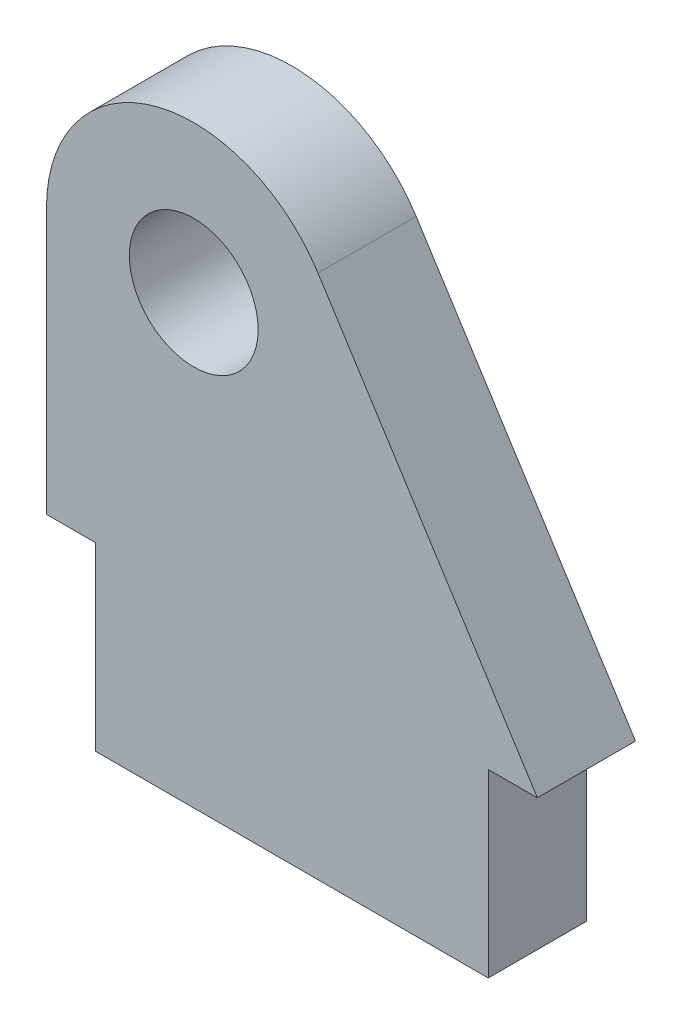
ISO-10303-21;
HEADER;
FILE_DESCRIPTION(('STEP AP214'),'2;1');
FILE_NAME('part.step','',(''),(''),'','','');
FILE_SCHEMA(('AUTOMOTIVE_DESIGN { 1 0 10303 214 1 1 1 1 }'));
ENDSEC;
DATA;
#1=APPLICATION_CONTEXT('core data for automotive mechanical design processes');
#2=APPLICATION_PROTOCOL_DEFINITION('international standard','automotive_design',2000,#1);
#3=PRODUCT_CONTEXT('',#1,'mechanical');
#4=PRODUCT('Part','Part','',(#3));
#5=PRODUCT_RELATED_PRODUCT_CATEGORY('part','',(#4));
#6=PRODUCT_DEFINITION_FORMATION('','',#4);
#7=PRODUCT_DEFINITION_CONTEXT('part definition',#1,'design');
#8=PRODUCT_DEFINITION('design','',#6,#7);
#9=PRODUCT_DEFINITION_SHAPE('','',#8);
#10=(LENGTH_UNIT() NAMED_UNIT(*) SI_UNIT(.MILLI.,.METRE.));
#11=(NAMED_UNIT(*) PLANE_ANGLE_UNIT() SI_UNIT($,.RADIAN.));
#12=(NAMED_UNIT(*) SI_UNIT($,.STERADIAN.) SOLID_ANGLE_UNIT());
#13=UNCERTAINTY_MEASURE_WITH_UNIT(LENGTH_MEASURE(1.E-05),#10,'distance_accuracy_value','');
#14=(GEOMETRIC_REPRESENTATION_CONTEXT(3) GLOBAL_UNCERTAINTY_ASSIGNED_CONTEXT((#13)) GLOBAL_UNIT_ASSIGNED_CONTEXT((#10,
#11,#12)) REPRESENTATION_CONTEXT('',''));
#15=CARTESIAN_POINT('',(0.,0.,0.));
#16=DIRECTION('',(0.,0.,1.));
#17=DIRECTION('',(1.,0.,0.));
#18=AXIS2_PLACEMENT_3D('',#15,#16,#17);
#19=CARTESIAN_POINT('',(-3.175,11.5138708,3.175));
#20=DIRECTION('',(0.,0.,1.));
#21=DIRECTION('',(1.,0.,0.));
#22=AXIS2_PLACEMENT_3D('',#19,#20,#21);
#23=PLANE('',#22);
#24=DIRECTION('',(1.,0.,0.));
#25=VECTOR('',#24,1.);
#26=CARTESIAN_POINT('',(-7.9375,2.921,3.175));
#27=LINE('',#26,#25);
#28=CARTESIAN_POINT('',(-7.9375,2.921,3.175));
#29=VERTEX_POINT('',#28);
#30=CARTESIAN_POINT('',(-6.35,2.921,3.175));
#31=VERTEX_POINT('',#30);
#32=EDGE_CURVE('E147',#29,#31,#27,.T.);
#33=ORIENTED_EDGE('',*,*,#32,.T.);
#34=DIRECTION('',(0.,-1.,0.));
#35=VECTOR('',#34,1.);
#36=CARTESIAN_POINT('',(-6.35,-2.921,3.175));
#37=LINE('',#36,#35);
#38=CARTESIAN_POINT('',(-6.35,-2.921,3.175));
#39=VERTEX_POINT('',#38);
#40=EDGE_CURVE('E95',#31,#39,#37,.T.);
#41=ORIENTED_EDGE('',*,*,#40,.T.);
#42=DIRECTION('',(1.,0.,0.));
#43=VECTOR('',#42,1.);
#44=CARTESIAN_POINT('',(6.35,-2.921,3.175));
#45=LINE('',#44,#43);
#46=CARTESIAN_POINT('',(6.35,-2.921,3.175));
#47=VERTEX_POINT('',#46);
#48=EDGE_CURVE('E162',#39,#47,#45,.T.);
#49=ORIENTED_EDGE('',*,*,#48,.T.);
#50=DIRECTION('',(0.,1.,0.));
#51=VECTOR('',#50,1.);
#52=CARTESIAN_POINT('',(6.35,-2.921,3.175));
#53=LINE('',#52,#51);
#54=CARTESIAN_POINT('',(6.35,2.921,3.175));
#55=VERTEX_POINT('',#54);
#56=EDGE_CURVE('E175',#47,#55,#53,.T.);
#57=ORIENTED_EDGE('',*,*,#56,.T.);
#58=DIRECTION('',(1.,0.,0.));
#59=VECTOR('',#58,1.);
#60=CARTESIAN_POINT('',(6.35,2.921,3.175));
#61=LINE('',#60,#59);
#62=CARTESIAN_POINT('',(7.9375,2.921,3.175));
#63=VERTEX_POINT('',#62);
#64=EDGE_CURVE('E114',#55,#63,#61,.T.);
#65=ORIENTED_EDGE('',*,*,#64,.T.);
#66=DIRECTION('',(-0.536836328902273,0.84368640854925,0.));
#67=VECTOR('',#66,1.);
#68=CARTESIAN_POINT('',(7.9375,2.921,3.175));
#69=LINE('',#68,#67);
#70=CARTESIAN_POINT('',(0.8430565207158,14.0705538163971,3.175));
#71=VERTEX_POINT('',#70);
#72=EDGE_CURVE('E108',#63,#71,#69,.T.);
#73=ORIENTED_EDGE('',*,*,#72,.T.);
#74=CARTESIAN_POINT('',(-3.175,11.5138708,3.175));
#75=DIRECTION('',(0.,0.,1.));
#76=DIRECTION('',(1.,0.,0.));
#77=AXIS2_PLACEMENT_3D('',#74,#75,#76);
#78=CIRCLE('',#77,4.7625);
#79=CARTESIAN_POINT('',(-7.9375,11.5138708,3.175));
#80=VERTEX_POINT('',#79);
#81=EDGE_CURVE('E112',#71,#80,#78,.T.);
#82=ORIENTED_EDGE('',*,*,#81,.T.);
#83=DIRECTION('',(0.,-1.,0.));
#84=VECTOR('',#83,1.);
#85=CARTESIAN_POINT('',(-7.9375,2.921,3.175));
#86=LINE('',#85,#84);
#87=EDGE_CURVE('E52',#80,#29,#86,.T.);
#88=ORIENTED_EDGE('',*,*,#87,.T.);
#89=EDGE_LOOP('',(#33,#41,#49,#57,#65,#73,#82,#88));
#90=FACE_BOUND('',#89,.T.);
#91=CARTESIAN_POINT('',(-3.175,11.5138708,3.175));
#92=DIRECTION('',(0.,0.,1.));
#93=DIRECTION('',(1.,0.,0.));
#94=AXIS2_PLACEMENT_3D('',#91,#92,#93);
#95=CIRCLE('',#94,2.0828);
#96=CARTESIAN_POINT('',(-1.0922,11.5138708,3.175));
#97=VERTEX_POINT('',#96);
#98=EDGE_CURVE('E136',#97,#97,#95,.T.);
#99=ORIENTED_EDGE('',*,*,#98,.F.);
#100=EDGE_LOOP('',(#99));
#101=FACE_BOUND('',#100,.T.);
#102=ADVANCED_FACE('F35',(#90,#101),#23,.T.);
#103=CARTESIAN_POINT('',(-3.175,11.5138708,0.));
#104=DIRECTION('',(0.,0.,1.));
#105=DIRECTION('',(1.,0.,0.));
#106=AXIS2_PLACEMENT_3D('',#103,#104,#105);
#107=PLANE('',#106);
#108=DIRECTION('',(1.,0.,0.));
#109=VECTOR('',#108,1.);
#110=CARTESIAN_POINT('',(-7.9375,2.921,0.));
#111=LINE('',#110,#109);
#112=CARTESIAN_POINT('',(-7.9375,2.921,0.));
#113=VERTEX_POINT('',#112);
#114=CARTESIAN_POINT('',(-6.35,2.921,0.));
#115=VERTEX_POINT('',#114);
#116=EDGE_CURVE('E132',#113,#115,#111,.T.);
#117=ORIENTED_EDGE('',*,*,#116,.F.);
#118=DIRECTION('',(0.,-1.,0.));
#119=VECTOR('',#118,1.);
#120=CARTESIAN_POINT('',(-7.9375,2.921,0.));
#121=LINE('',#120,#119);
#122=CARTESIAN_POINT('',(-7.9375,11.5138708,0.));
#123=VERTEX_POINT('',#122);
#124=EDGE_CURVE('E87',#123,#113,#121,.T.);
#125=ORIENTED_EDGE('',*,*,#124,.F.);
#126=CARTESIAN_POINT('',(-3.175,11.5138708,0.));
#127=DIRECTION('',(0.,0.,1.));
#128=DIRECTION('',(1.,0.,0.));
#129=AXIS2_PLACEMENT_3D('',#126,#127,#128);
#130=CIRCLE('',#129,4.7625);
#131=CARTESIAN_POINT('',(0.8430565207158,14.0705538163971,0.));
#132=VERTEX_POINT('',#131);
#133=EDGE_CURVE('E81',#132,#123,#130,.T.);
#134=ORIENTED_EDGE('',*,*,#133,.F.);
#135=DIRECTION('',(-0.536836328902273,0.84368640854925,0.));
#136=VECTOR('',#135,1.);
#137=CARTESIAN_POINT('',(7.9375,2.921,0.));
#138=LINE('',#137,#136);
#139=CARTESIAN_POINT('',(7.9375,2.921,0.));
#140=VERTEX_POINT('',#139);
#141=EDGE_CURVE('E122',#140,#132,#138,.T.);
#142=ORIENTED_EDGE('',*,*,#141,.F.);
#143=DIRECTION('',(1.,0.,0.));
#144=VECTOR('',#143,1.);
#145=CARTESIAN_POINT('',(6.35,2.921,0.));
#146=LINE('',#145,#144);
#147=CARTESIAN_POINT('',(6.35,2.921,0.));
#148=VERTEX_POINT('',#147);
#149=EDGE_CURVE('E142',#148,#140,#146,.T.);
#150=ORIENTED_EDGE('',*,*,#149,.F.);
#151=DIRECTION('',(0.,1.,0.));
#152=VECTOR('',#151,1.);
#153=CARTESIAN_POINT('',(6.35,-2.921,0.));
#154=LINE('',#153,#152);
#155=CARTESIAN_POINT('',(6.35,-2.921,0.));
#156=VERTEX_POINT('',#155);
#157=EDGE_CURVE('E140',#156,#148,#154,.T.);
#158=ORIENTED_EDGE('',*,*,#157,.F.);
#159=DIRECTION('',(1.,0.,0.));
#160=VECTOR('',#159,1.);
#161=CARTESIAN_POINT('',(6.35,-2.921,0.));
#162=LINE('',#161,#160);
#163=CARTESIAN_POINT('',(-6.35,-2.921,0.));
#164=VERTEX_POINT('',#163);
#165=EDGE_CURVE('E138',#164,#156,#162,.T.);
#166=ORIENTED_EDGE('',*,*,#165,.F.);
#167=DIRECTION('',(0.,-1.,0.));
#168=VECTOR('',#167,1.);
#169=CARTESIAN_POINT('',(-6.35,-2.921,0.));
#170=LINE('',#169,#168);
#171=EDGE_CURVE('E135',#115,#164,#170,.T.);
#172=ORIENTED_EDGE('',*,*,#171,.F.);
#173=EDGE_LOOP('',(#117,#125,#134,#142,#150,#158,#166,#172));
#174=FACE_BOUND('',#173,.T.);
#175=CARTESIAN_POINT('',(-3.175,11.5138708,0.));
#176=DIRECTION('',(0.,0.,1.));
#177=DIRECTION('',(1.,0.,0.));
#178=AXIS2_PLACEMENT_3D('',#175,#176,#177);
#179=CIRCLE('',#178,2.0828);
#180=CARTESIAN_POINT('',(-1.0922,11.5138708,0.));
#181=VERTEX_POINT('',#180);
#182=EDGE_CURVE('E181',#181,#181,#179,.T.);
#183=ORIENTED_EDGE('',*,*,#182,.T.);
#184=EDGE_LOOP('',(#183));
#185=FACE_BOUND('',#184,.T.);
#186=ADVANCED_FACE('F166',(#174,#185),#107,.F.);
#187=CARTESIAN_POINT('',(-7.9375,2.921,3.175));
#188=DIRECTION('',(0.,1.,0.));
#189=DIRECTION('',(0.,0.,1.));
#190=AXIS2_PLACEMENT_3D('',#187,#188,#189);
#191=PLANE('',#190);
#192=ORIENTED_EDGE('',*,*,#116,.T.);
#193=DIRECTION('',(0.,0.,-1.));
#194=VECTOR('',#193,1.);
#195=CARTESIAN_POINT('',(-6.35,2.921,3.175));
#196=LINE('',#195,#194);
#197=EDGE_CURVE('E11',#31,#115,#196,.T.);
#198=ORIENTED_EDGE('',*,*,#197,.F.);
#199=ORIENTED_EDGE('',*,*,#32,.F.);
#200=DIRECTION('',(0.,0.,-1.));
#201=VECTOR('',#200,1.);
#202=CARTESIAN_POINT('',(-7.9375,2.921,3.175));
#203=LINE('',#202,#201);
#204=EDGE_CURVE('E128',#29,#113,#203,.T.);
#205=ORIENTED_EDGE('',*,*,#204,.T.);
#206=EDGE_LOOP('',(#192,#198,#199,#205));
#207=FACE_BOUND('',#206,.T.);
#208=ADVANCED_FACE('F37',(#207),#191,.F.);
#209=CARTESIAN_POINT('',(-6.35,-2.921,3.175));
#210=DIRECTION('',(1.,0.,0.));
#211=DIRECTION('',(0.,0.,-1.));
#212=AXIS2_PLACEMENT_3D('',#209,#210,#211);
#213=PLANE('',#212);
#214=ORIENTED_EDGE('',*,*,#171,.T.);
#215=DIRECTION('',(0.,0.,-1.));
#216=VECTOR('',#215,1.);
#217=CARTESIAN_POINT('',(-6.35,-2.921,3.175));
#218=LINE('',#217,#216);
#219=EDGE_CURVE('E44',#39,#164,#218,.T.);
#220=ORIENTED_EDGE('',*,*,#219,.F.);
#221=ORIENTED_EDGE('',*,*,#40,.F.);
#222=ORIENTED_EDGE('',*,*,#197,.T.);
#223=EDGE_LOOP('',(#214,#220,#221,#222));
#224=FACE_BOUND('',#223,.T.);
#225=ADVANCED_FACE('F209',(#224),#213,.F.);
#226=CARTESIAN_POINT('',(6.35,-2.921,3.175));
#227=DIRECTION('',(0.,1.,0.));
#228=DIRECTION('',(-1.,0.,0.));
#229=AXIS2_PLACEMENT_3D('',#226,#227,#228);
#230=PLANE('',#229);
#231=ORIENTED_EDGE('',*,*,#165,.T.);
#232=DIRECTION('',(0.,0.,-1.));
#233=VECTOR('',#232,1.);
#234=CARTESIAN_POINT('',(6.35,-2.921,3.175));
#235=LINE('',#234,#233);
#236=EDGE_CURVE('E154',#47,#156,#235,.T.);
#237=ORIENTED_EDGE('',*,*,#236,.F.);
#238=ORIENTED_EDGE('',*,*,#48,.F.);
#239=ORIENTED_EDGE('',*,*,#219,.T.);
#240=EDGE_LOOP('',(#231,#237,#238,#239));
#241=FACE_BOUND('',#240,.T.);
#242=ADVANCED_FACE('F160',(#241),#230,.F.);
#243=CARTESIAN_POINT('',(6.35,-2.921,3.175));
#244=DIRECTION('',(-1.,0.,0.));
#245=DIRECTION('',(0.,0.,1.));
#246=AXIS2_PLACEMENT_3D('',#243,#244,#245);
#247=PLANE('',#246);
#248=ORIENTED_EDGE('',*,*,#157,.T.);
#249=DIRECTION('',(0.,0.,-1.));
#250=VECTOR('',#249,1.);
#251=CARTESIAN_POINT('',(6.35,2.921,3.175));
#252=LINE('',#251,#250);
#253=EDGE_CURVE('E151',#55,#148,#252,.T.);
#254=ORIENTED_EDGE('',*,*,#253,.F.);
#255=ORIENTED_EDGE('',*,*,#56,.F.);
#256=ORIENTED_EDGE('',*,*,#236,.T.);
#257=EDGE_LOOP('',(#248,#254,#255,#256));
#258=FACE_BOUND('',#257,.T.);
#259=ADVANCED_FACE('F171',(#258),#247,.F.);
#260=CARTESIAN_POINT('',(6.35,2.921,3.175));
#261=DIRECTION('',(0.,1.,0.));
#262=DIRECTION('',(-1.,0.,0.));
#263=AXIS2_PLACEMENT_3D('',#260,#261,#262);
#264=PLANE('',#263);
#265=ORIENTED_EDGE('',*,*,#149,.T.);
#266=DIRECTION('',(0.,0.,-1.));
#267=VECTOR('',#266,1.);
#268=CARTESIAN_POINT('',(7.9375,2.921,3.175));
#269=LINE('',#268,#267);
#270=EDGE_CURVE('E123',#63,#140,#269,.T.);
#271=ORIENTED_EDGE('',*,*,#270,.F.);
#272=ORIENTED_EDGE('',*,*,#64,.F.);
#273=ORIENTED_EDGE('',*,*,#253,.T.);
#274=EDGE_LOOP('',(#265,#271,#272,#273));
#275=FACE_BOUND('',#274,.T.);
#276=ADVANCED_FACE('F174',(#275),#264,.F.);
#277=CARTESIAN_POINT('',(7.9375,2.921,3.175));
#278=DIRECTION('',(-0.843686408549249,-0.536836328902272,0.));
#279=DIRECTION('',(0.536836328902273,-0.84368640854925,0.));
#280=AXIS2_PLACEMENT_3D('',#277,#278,#279);
#281=PLANE('',#280);
#282=ORIENTED_EDGE('',*,*,#141,.T.);
#283=DIRECTION('',(0.,0.,-1.));
#284=VECTOR('',#283,1.);
#285=CARTESIAN_POINT('',(0.8430565207158,14.0705538163971,3.175));
#286=LINE('',#285,#284);
#287=EDGE_CURVE('E119',#71,#132,#286,.T.);
#288=ORIENTED_EDGE('',*,*,#287,.F.);
#289=ORIENTED_EDGE('',*,*,#72,.F.);
#290=ORIENTED_EDGE('',*,*,#270,.T.);
#291=EDGE_LOOP('',(#282,#288,#289,#290));
#292=FACE_BOUND('',#291,.T.);
#293=ADVANCED_FACE('F120',(#292),#281,.F.);
#294=CARTESIAN_POINT('',(-3.175,11.5138708,3.175));
#295=DIRECTION('',(0.,0.,-1.));
#296=DIRECTION('',(-1.,0.,0.));
#297=AXIS2_PLACEMENT_3D('',#294,#295,#296);
#298=CYLINDRICAL_SURFACE('',#297,4.7625);
#299=ORIENTED_EDGE('',*,*,#133,.T.);
#300=DIRECTION('',(0.,0.,-1.));
#301=VECTOR('',#300,1.);
#302=CARTESIAN_POINT('',(-7.9375,11.5138708,3.175));
#303=LINE('',#302,#301);
#304=EDGE_CURVE('E124',#80,#123,#303,.T.);
#305=ORIENTED_EDGE('',*,*,#304,.F.);
#306=ORIENTED_EDGE('',*,*,#81,.F.);
#307=ORIENTED_EDGE('',*,*,#287,.T.);
#308=EDGE_LOOP('',(#299,#305,#306,#307));
#309=FACE_BOUND('',#308,.T.);
#310=ADVANCED_FACE('F126',(#309),#298,.T.);
#311=CARTESIAN_POINT('',(-7.9375,2.921,3.175));
#312=DIRECTION('',(1.,0.,0.));
#313=DIRECTION('',(0.,1.,0.));
#314=AXIS2_PLACEMENT_3D('',#311,#312,#313);
#315=PLANE('',#314);
#316=ORIENTED_EDGE('',*,*,#124,.T.);
#317=ORIENTED_EDGE('',*,*,#204,.F.);
#318=ORIENTED_EDGE('',*,*,#87,.F.);
#319=ORIENTED_EDGE('',*,*,#304,.T.);
#320=EDGE_LOOP('',(#316,#317,#318,#319));
#321=FACE_BOUND('',#320,.T.);
#322=ADVANCED_FACE('F197',(#321),#315,.F.);
#323=CARTESIAN_POINT('',(-3.175,11.5138708,3.175));
#324=DIRECTION('',(0.,0.,-1.));
#325=DIRECTION('',(-1.,0.,0.));
#326=AXIS2_PLACEMENT_3D('',#323,#324,#325);
#327=CYLINDRICAL_SURFACE('',#326,2.0828);
#328=ORIENTED_EDGE('',*,*,#98,.T.);
#329=EDGE_LOOP('',(#328));
#330=FACE_BOUND('',#329,.T.);
#331=ORIENTED_EDGE('',*,*,#182,.F.);
#332=EDGE_LOOP('',(#331));
#333=FACE_BOUND('',#332,.T.);
#334=ADVANCED_FACE('F187',(#330,#333),#327,.F.);
#335=CLOSED_SHELL('',(#102,#186,#208,#225,#242,#259,#276,#293,#310,#322,#334));
#336=MANIFOLD_SOLID_BREP('B2',#335);
#337=ADVANCED_BREP_SHAPE_REPRESENTATION('',(#18,#336),#14);
#338=SHAPE_DEFINITION_REPRESENTATION(#9,#337);
ENDSEC;
END-ISO-10303-21;
